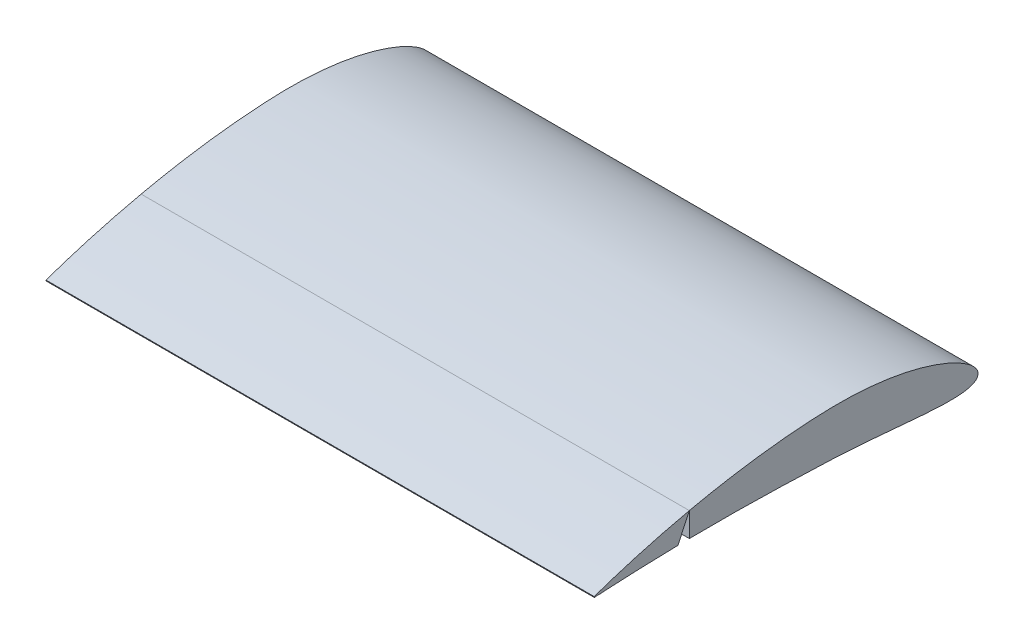
ISO-10303-21;
HEADER;
FILE_DESCRIPTION(('STEP AP214'),'2;1');
FILE_NAME('part.step','',(''),(''),'','','');
FILE_SCHEMA(('AUTOMOTIVE_DESIGN { 1 0 10303 214 1 1 1 1 }'));
ENDSEC;
DATA;
#1=APPLICATION_CONTEXT('core data for automotive mechanical design processes');
#2=APPLICATION_PROTOCOL_DEFINITION('international standard','automotive_design',2000,#1);
#3=PRODUCT_CONTEXT('',#1,'mechanical');
#4=PRODUCT('Part','Part','',(#3));
#5=PRODUCT_RELATED_PRODUCT_CATEGORY('part','',(#4));
#6=PRODUCT_DEFINITION_FORMATION('','',#4);
#7=PRODUCT_DEFINITION_CONTEXT('part definition',#1,'design');
#8=PRODUCT_DEFINITION('design','',#6,#7);
#9=PRODUCT_DEFINITION_SHAPE('','',#8);
#10=(LENGTH_UNIT() NAMED_UNIT(*) SI_UNIT(.MILLI.,.METRE.));
#11=(NAMED_UNIT(*) PLANE_ANGLE_UNIT() SI_UNIT($,.RADIAN.));
#12=(NAMED_UNIT(*) SI_UNIT($,.STERADIAN.) SOLID_ANGLE_UNIT());
#13=UNCERTAINTY_MEASURE_WITH_UNIT(LENGTH_MEASURE(1.E-05),#10,'distance_accuracy_value','');
#14=(GEOMETRIC_REPRESENTATION_CONTEXT(3) GLOBAL_UNCERTAINTY_ASSIGNED_CONTEXT((#13)) GLOBAL_UNIT_ASSIGNED_CONTEXT((#10,
#11,#12)) REPRESENTATION_CONTEXT('',''));
#15=CARTESIAN_POINT('',(0.,0.,0.));
#16=DIRECTION('',(0.,0.,1.));
#17=DIRECTION('',(1.,0.,0.));
#18=AXIS2_PLACEMENT_3D('',#15,#16,#17);
#19=CARTESIAN_POINT('',(-254.,-0.0302571964763549,354.787327227915));
#20=CARTESIAN_POINT('',(-254.,-0.202511549774369,354.777220058735));
#21=CARTESIAN_POINT('',(-254.,-0.758116619532224,354.744619463571));
#22=CARTESIAN_POINT('',(-254.,-0.0353878265544988,352.780150329408));
#23=CARTESIAN_POINT('',(-254.,-0.406394891328532,350.227621537646));
#24=CARTESIAN_POINT('',(-254.,0.191518705423128,345.076973542852));
#25=CARTESIAN_POINT('',(-254.,0.426846954997304,338.388880463138));
#26=CARTESIAN_POINT('',(-254.,0.912902226587254,329.767358245601));
#27=CARTESIAN_POINT('',(-254.,1.37107480853054,319.513378005819));
#28=CARTESIAN_POINT('',(-254.,1.85212662662604,307.681856469284));
#29=CARTESIAN_POINT('',(-254.,2.2828903737653,294.437996631764));
#30=CARTESIAN_POINT('',(-254.,2.65636592644588,279.933149694368));
#31=CARTESIAN_POINT('',(-254.,2.90744759821903,264.337268620967));
#32=CARTESIAN_POINT('',(-254.,3.02848065946825,247.830237404837));
#33=CARTESIAN_POINT('',(-254.,2.97910623211237,224.541124113717));
#34=CARTESIAN_POINT('',(-254.,2.58624656268472,200.671973719441));
#35=CARTESIAN_POINT('',(-254.,1.91789319340299,176.483884619505));
#36=CARTESIAN_POINT('',(-254.,1.28674404323604,158.296467958687));
#37=CARTESIAN_POINT('',(-254.,0.674535202653767,140.48477689744));
#38=CARTESIAN_POINT('',(-254.,-0.458414507964394,117.937239158073));
#39=CARTESIAN_POINT('',(-254.,-2.15355585803942,96.4067365521407));
#40=CARTESIAN_POINT('',(-254.,-3.98391169785236,75.9298626432168));
#41=CARTESIAN_POINT('',(-254.,-5.23803481691952,61.9523939500743));
#42=CARTESIAN_POINT('',(-254.,-6.3018667845873,49.0830780174977));
#43=CARTESIAN_POINT('',(-254.,-7.05379709208437,37.4470572233417));
#44=CARTESIAN_POINT('',(-254.,-7.40487495085787,27.1638266260831));
#45=CARTESIAN_POINT('',(-254.,-7.26852765592077,18.3491197902741));
#46=CARTESIAN_POINT('',(-254.,-6.58746462442697,11.0873159681167));
#47=CARTESIAN_POINT('',(-254.,-5.28808573883758,5.4507808849597));
#48=CARTESIAN_POINT('',(-254.,-3.30894318563573,1.35108725963543));
#49=CARTESIAN_POINT('',(-254.,-0.148325215865237,-0.987487677240321));
#50=CARTESIAN_POINT('',(-254.,3.7967578133831,-0.765838064798878));
#51=CARTESIAN_POINT('',(-254.,7.71649979382027,1.67922407257184));
#52=CARTESIAN_POINT('',(-254.,11.8553419578337,5.92689766090299));
#53=CARTESIAN_POINT('',(-254.,16.2262899348965,12.1072031542234));
#54=CARTESIAN_POINT('',(-254.,20.7343193498453,20.187014187513));
#55=CARTESIAN_POINT('',(-254.,25.2201252971746,30.130463623116));
#56=CARTESIAN_POINT('',(-254.,29.5108543834638,41.8433907768923));
#57=CARTESIAN_POINT('',(-254.,33.4329059974258,55.1997604360673));
#58=CARTESIAN_POINT('',(-254.,36.8104805743368,70.0434509571498));
#59=CARTESIAN_POINT('',(-254.,39.4786761807971,86.1884085277303));
#60=CARTESIAN_POINT('',(-254.,41.32105063238,103.42216726238));
#61=CARTESIAN_POINT('',(-254.,42.2288581946823,121.516747473044));
#62=CARTESIAN_POINT('',(-254.,42.1113766684293,140.09669102153));
#63=CARTESIAN_POINT('',(-254.,41.1132128906756,158.902335219002));
#64=CARTESIAN_POINT('',(-254.,39.0904540579609,183.961657870227));
#65=CARTESIAN_POINT('',(-254.,36.0047557168601,208.774809212926));
#66=CARTESIAN_POINT('',(-254.,31.1455287976255,238.622276389231));
#67=CARTESIAN_POINT('',(-254.,26.6515697314507,261.175777938493));
#68=CARTESIAN_POINT('',(-254.,21.7242725259394,282.422876263721));
#69=CARTESIAN_POINT('',(-254.,17.1306006385399,300.598349456261));
#70=CARTESIAN_POINT('',(-254.,11.7988919274353,319.654473711953));
#71=CARTESIAN_POINT('',(-254.,6.72155114802005,336.024074691811));
#72=CARTESIAN_POINT('',(-254.,3.49779827393597,345.800950265157));
#73=CARTESIAN_POINT('',(-254.,1.92709586834348,350.478726649503));
#74=CARTESIAN_POINT('',(-254.,0.953557869568799,353.29965963041));
#75=CARTESIAN_POINT('',(-254.,0.519388000117919,354.559877308969));
#76=CARTESIAN_POINT('',(-254.,0.410417886541196,354.876173010782));
#77=B_SPLINE_CURVE_WITH_KNOTS('',3,(#19,#20,#21,#22,#23,#24,#25,#26,#27,#28,#29,#30,#31,#32,#33,
#34,#35,#36,#37,#38,#39,#40,#41,#42,#43,#44,#45,#46,#47,#48,#49,#50,#51,#52,#53,#54,#55,#56,#57,
#58,#59,#60,#61,#62,#63,#64,#65,#66,#67,#68,#69,#70,#71,#72,#73,#74,#75,#76),.UNSPECIFIED.,.F.,
.F.,(4,1,1,1,1,1,1,1,1,1,1,1,1,1,1,1,1,1,1,1,1,1,1,1,1,1,1,1,1,1,1,1,1,1,1,1,1,1,1,1,1,1,1,1,1,
1,1,1,1,1,1,1,1,1,1,4),(0.,0.00061435602735338,0.00198160056276364,0.00606849911990259,
0.0128259983002053,0.0221600600259541,0.0339528411484215,0.0480573219049674,0.0643016527838605,
0.0824806064748046,0.102390013464696,0.123786894847983,0.146429707819126,0.170067604158041,
0.219268231220122,0.244299756437978,0.269272617042279,0.293879334559277,0.317367886846568,
0.361825599196296,0.382415541627446,0.401655123624231,0.419361860817184,0.435356743556399,
0.44945739068769,0.461534248286615,0.471483960270294,0.479298491667603,0.485175806315722,
0.489815015537041,0.49445371882196,0.500384211459872,0.508369297965653,0.518670584727767,
0.531320006060474,0.54625561026072,0.563345994084458,0.58242326585592,0.60328874622392,
0.625720296766354,0.649474912467889,0.674310012117921,0.699958821683972,0.725614899189679,
0.751503233324799,0.803021620411888,0.828087427427487,0.875472920842336,0.897280851310736,
0.917503738861992,0.952328750245583,0.978398030734231,0.987765198149775,0.994535224157492,
0.998628423374974,1.),.UNSPECIFIED.);
#78=DIRECTION('',(1.,0.,0.));
#79=VECTOR('',#78,1.);
#80=SURFACE_OF_LINEAR_EXTRUSION('',#77,#79);
#81=DIRECTION('',(1.,0.,0.));
#82=VECTOR('',#81,1.);
#83=CARTESIAN_POINT('',(-254.,2.68576626150921,277.250314183645));
#84=LINE('',#83,#82);
#85=CARTESIAN_POINT('',(-254.,2.6857662610756,277.250314183847));
#86=VERTEX_POINT('',#85);
#87=CARTESIAN_POINT('',(254.,2.68576626107558,277.250314183847));
#88=VERTEX_POINT('',#87);
#89=EDGE_CURVE('E68',#86,#88,#84,.T.);
#90=ORIENTED_EDGE('',*,*,#89,.T.);
#91=CARTESIAN_POINT('',(254.,-0.0302571964763549,354.787327227915));
#92=CARTESIAN_POINT('',(254.,-0.202511549774369,354.777220058735));
#93=CARTESIAN_POINT('',(254.,-0.758116619532224,354.744619463571));
#94=CARTESIAN_POINT('',(254.,-0.0353878265544988,352.780150329408));
#95=CARTESIAN_POINT('',(254.,-0.406394891328532,350.227621537646));
#96=CARTESIAN_POINT('',(254.,0.191518705423128,345.076973542852));
#97=CARTESIAN_POINT('',(254.,0.426846954997304,338.388880463138));
#98=CARTESIAN_POINT('',(254.,0.912902226587254,329.767358245601));
#99=CARTESIAN_POINT('',(254.,1.37107480853054,319.513378005819));
#100=CARTESIAN_POINT('',(254.,1.85212662662604,307.681856469284));
#101=CARTESIAN_POINT('',(254.,2.2828903737653,294.437996631764));
#102=CARTESIAN_POINT('',(254.,2.65636592644588,279.933149694368));
#103=CARTESIAN_POINT('',(254.,2.90744759821903,264.337268620967));
#104=CARTESIAN_POINT('',(254.,3.02848065946825,247.830237404837));
#105=CARTESIAN_POINT('',(254.,2.97910623211237,224.541124113717));
#106=CARTESIAN_POINT('',(254.,2.58624656268472,200.671973719441));
#107=CARTESIAN_POINT('',(254.,1.91789319340299,176.483884619505));
#108=CARTESIAN_POINT('',(254.,1.28674404323604,158.296467958687));
#109=CARTESIAN_POINT('',(254.,0.674535202653767,140.48477689744));
#110=CARTESIAN_POINT('',(254.,-0.458414507964394,117.937239158073));
#111=CARTESIAN_POINT('',(254.,-2.15355585803942,96.4067365521407));
#112=CARTESIAN_POINT('',(254.,-3.98391169785236,75.9298626432168));
#113=CARTESIAN_POINT('',(254.,-5.23803481691952,61.9523939500743));
#114=CARTESIAN_POINT('',(254.,-6.3018667845873,49.0830780174977));
#115=CARTESIAN_POINT('',(254.,-7.05379709208437,37.4470572233417));
#116=CARTESIAN_POINT('',(254.,-7.40487495085787,27.1638266260831));
#117=CARTESIAN_POINT('',(254.,-7.26852765592077,18.3491197902741));
#118=CARTESIAN_POINT('',(254.,-6.58746462442697,11.0873159681167));
#119=CARTESIAN_POINT('',(254.,-5.28808573883758,5.4507808849597));
#120=CARTESIAN_POINT('',(254.,-3.30894318563573,1.35108725963543));
#121=CARTESIAN_POINT('',(254.,-0.148325215865237,-0.987487677240321));
#122=CARTESIAN_POINT('',(254.,3.7967578133831,-0.765838064798878));
#123=CARTESIAN_POINT('',(254.,7.71649979382027,1.67922407257184));
#124=CARTESIAN_POINT('',(254.,11.8553419578337,5.92689766090299));
#125=CARTESIAN_POINT('',(254.,16.2262899348965,12.1072031542234));
#126=CARTESIAN_POINT('',(254.,20.7343193498453,20.187014187513));
#127=CARTESIAN_POINT('',(254.,25.2201252971746,30.130463623116));
#128=CARTESIAN_POINT('',(254.,29.5108543834638,41.8433907768923));
#129=CARTESIAN_POINT('',(254.,33.4329059974258,55.1997604360673));
#130=CARTESIAN_POINT('',(254.,36.8104805743368,70.0434509571498));
#131=CARTESIAN_POINT('',(254.,39.4786761807971,86.1884085277303));
#132=CARTESIAN_POINT('',(254.,41.32105063238,103.42216726238));
#133=CARTESIAN_POINT('',(254.,42.2288581946823,121.516747473044));
#134=CARTESIAN_POINT('',(254.,42.1113766684293,140.09669102153));
#135=CARTESIAN_POINT('',(254.,41.1132128906756,158.902335219002));
#136=CARTESIAN_POINT('',(254.,39.0904540579609,183.961657870227));
#137=CARTESIAN_POINT('',(254.,36.0047557168601,208.774809212926));
#138=CARTESIAN_POINT('',(254.,31.1455287976255,238.622276389231));
#139=CARTESIAN_POINT('',(254.,26.6515697314507,261.175777938493));
#140=CARTESIAN_POINT('',(254.,21.7242725259394,282.422876263721));
#141=CARTESIAN_POINT('',(254.,17.1306006385399,300.598349456261));
#142=CARTESIAN_POINT('',(254.,11.7988919274353,319.654473711953));
#143=CARTESIAN_POINT('',(254.,6.72155114802005,336.024074691811));
#144=CARTESIAN_POINT('',(254.,3.49779827393597,345.800950265157));
#145=CARTESIAN_POINT('',(254.,1.92709586834348,350.478726649503));
#146=CARTESIAN_POINT('',(254.,0.953557869568799,353.29965963041));
#147=CARTESIAN_POINT('',(254.,0.519388000117919,354.559877308969));
#148=CARTESIAN_POINT('',(254.,0.410417886541196,354.876173010782));
#149=B_SPLINE_CURVE_WITH_KNOTS('',3,(#91,#92,#93,#94,#95,#96,#97,#98,#99,#100,#101,#102,#103,
#104,#105,#106,#107,#108,#109,#110,#111,#112,#113,#114,#115,#116,#117,#118,#119,#120,#121,#122,
#123,#124,#125,#126,#127,#128,#129,#130,#131,#132,#133,#134,#135,#136,#137,#138,#139,#140,#141,
#142,#143,#144,#145,#146,#147,#148),.UNSPECIFIED.,.F.,.F.,(4,1,1,1,1,1,1,1,1,1,1,1,1,1,1,1,1,1,
1,1,1,1,1,1,1,1,1,1,1,1,1,1,1,1,1,1,1,1,1,1,1,1,1,1,1,1,1,1,1,1,1,1,1,1,1,4),(0.,
0.00061435602735338,0.00198160056276364,0.00606849911990259,0.0128259983002053,
0.0221600600259541,0.0339528411484215,0.0480573219049674,0.0643016527838605,0.0824806064748046,
0.102390013464696,0.123786894847983,0.146429707819126,0.170067604158041,0.219268231220122,
0.244299756437978,0.269272617042279,0.293879334559277,0.317367886846568,0.361825599196296,
0.382415541627446,0.401655123624231,0.419361860817184,0.435356743556399,0.44945739068769,
0.461534248286615,0.471483960270294,0.479298491667603,0.485175806315722,0.489815015537041,
0.49445371882196,0.500384211459872,0.508369297965653,0.518670584727767,0.531320006060474,
0.54625561026072,0.563345994084458,0.58242326585592,0.60328874622392,0.625720296766354,
0.649474912467889,0.674310012117921,0.699958821683972,0.725614899189679,0.751503233324799,
0.803021620411888,0.828087427427487,0.875472920842336,0.897280851310736,0.917503738861992,
0.952328750245583,0.978398030734231,0.987765198149775,0.994535224157492,0.998628423374974,1.),.UNSPECIFIED.);
#150=CARTESIAN_POINT('',(254.,-0.030257196476355,354.787327227915));
#151=VERTEX_POINT('',#150);
#152=EDGE_CURVE('E54',#151,#88,#149,.T.);
#153=ORIENTED_EDGE('',*,*,#152,.F.);
#154=DIRECTION('',(1.,0.,0.));
#155=VECTOR('',#154,1.);
#156=CARTESIAN_POINT('',(-254.,-0.030257196476355,354.787327227915));
#157=LINE('',#156,#155);
#158=CARTESIAN_POINT('',(-254.,-0.030257196476355,354.787327227915));
#159=VERTEX_POINT('',#158);
#160=EDGE_CURVE('E121',#159,#151,#157,.T.);
#161=ORIENTED_EDGE('',*,*,#160,.F.);
#162=EDGE_CURVE('E103',#159,#86,#77,.T.);
#163=ORIENTED_EDGE('',*,*,#162,.T.);
#164=EDGE_LOOP('',(#90,#153,#161,#163));
#165=FACE_BOUND('',#164,.T.);
#166=ADVANCED_FACE('F50',(#165),#80,.T.);
#167=CARTESIAN_POINT('',(254.,25.3109880456868,266.699999982787));
#168=VERTEX_POINT('',#167);
#169=CARTESIAN_POINT('',(254.,0.410417886541196,354.876173010782));
#170=VERTEX_POINT('',#169);
#171=EDGE_CURVE('E101',#168,#170,#149,.T.);
#172=ORIENTED_EDGE('',*,*,#171,.F.);
#173=DIRECTION('',(-1.,0.,0.));
#174=VECTOR('',#173,1.);
#175=CARTESIAN_POINT('',(254.001,25.3109880418854,266.7));
#176=LINE('',#175,#174);
#177=CARTESIAN_POINT('',(-254.,25.3109880418854,266.7));
#178=VERTEX_POINT('',#177);
#179=EDGE_CURVE('E87',#168,#178,#176,.T.);
#180=ORIENTED_EDGE('',*,*,#179,.T.);
#181=CARTESIAN_POINT('',(-254.,0.410417886541196,354.876173010782));
#182=VERTEX_POINT('',#181);
#183=EDGE_CURVE('E99',#178,#182,#77,.T.);
#184=ORIENTED_EDGE('',*,*,#183,.T.);
#185=DIRECTION('',(1.,0.,0.));
#186=VECTOR('',#185,1.);
#187=CARTESIAN_POINT('',(-254.,0.410417886541196,354.876173010782));
#188=LINE('',#187,#186);
#189=EDGE_CURVE('E108',#182,#170,#188,.T.);
#190=ORIENTED_EDGE('',*,*,#189,.T.);
#191=EDGE_LOOP('',(#172,#180,#184,#190));
#192=FACE_BOUND('',#191,.T.);
#193=ADVANCED_FACE('F97',(#192),#80,.T.);
#194=CARTESIAN_POINT('',(-254.,6.95548452892668,1.34686834904547));
#195=DIRECTION('',(-1.,0.,0.));
#196=DIRECTION('',(0.,0.,1.));
#197=AXIS2_PLACEMENT_3D('',#194,#195,#196);
#198=PLANE('',#197);
#199=DIRECTION('',(0.,0.906307787036649,-0.422618261740701));
#200=VECTOR('',#199,1.);
#201=CARTESIAN_POINT('',(-254.,25.3109880418854,266.7));
#202=LINE('',#201,#200);
#203=EDGE_CURVE('E61',#86,#178,#202,.T.);
#204=ORIENTED_EDGE('',*,*,#203,.F.);
#205=ORIENTED_EDGE('',*,*,#162,.F.);
#206=DIRECTION('',(0.,-0.980275441523261,-0.197636177726589));
#207=VECTOR('',#206,1.);
#208=CARTESIAN_POINT('',(-254.,-0.030257196476355,354.787327227915));
#209=LINE('',#208,#207);
#210=EDGE_CURVE('E94',#182,#159,#209,.T.);
#211=ORIENTED_EDGE('',*,*,#210,.F.);
#212=ORIENTED_EDGE('',*,*,#183,.F.);
#213=EDGE_LOOP('',(#204,#205,#211,#212));
#214=FACE_BOUND('',#213,.T.);
#215=ADVANCED_FACE('F106',(#214),#198,.T.);
#216=CARTESIAN_POINT('',(254.,6.95548452892668,1.34686834904547));
#217=DIRECTION('',(-1.,0.,0.));
#218=DIRECTION('',(0.,0.,1.));
#219=AXIS2_PLACEMENT_3D('',#216,#217,#218);
#220=PLANE('',#219);
#221=ORIENTED_EDGE('',*,*,#152,.T.);
#222=DIRECTION('',(0.,-0.906307787036649,0.422618261740702));
#223=VECTOR('',#222,1.);
#224=CARTESIAN_POINT('',(254.,25.3109880418854,266.7));
#225=LINE('',#224,#223);
#226=EDGE_CURVE('E12',#168,#88,#225,.T.);
#227=ORIENTED_EDGE('',*,*,#226,.F.);
#228=ORIENTED_EDGE('',*,*,#171,.T.);
#229=DIRECTION('',(0.,-0.980275441523261,-0.197636177726589));
#230=VECTOR('',#229,1.);
#231=CARTESIAN_POINT('',(254.,-0.030257196476355,354.787327227915));
#232=LINE('',#231,#230);
#233=EDGE_CURVE('E118',#170,#151,#232,.T.);
#234=ORIENTED_EDGE('',*,*,#233,.T.);
#235=EDGE_LOOP('',(#221,#227,#228,#234));
#236=FACE_BOUND('',#235,.T.);
#237=ADVANCED_FACE('F127',(#236),#220,.F.);
#238=CARTESIAN_POINT('',(-254.,-0.030257196476355,354.787327227915));
#239=DIRECTION('',(0.,-0.197636177726589,0.980275441523261));
#240=DIRECTION('',(0.,-0.980275441523261,-0.197636177726589));
#241=AXIS2_PLACEMENT_3D('',#238,#239,#240);
#242=PLANE('',#241);
#243=ORIENTED_EDGE('',*,*,#160,.T.);
#244=ORIENTED_EDGE('',*,*,#233,.F.);
#245=ORIENTED_EDGE('',*,*,#189,.F.);
#246=ORIENTED_EDGE('',*,*,#210,.T.);
#247=EDGE_LOOP('',(#243,#244,#245,#246));
#248=FACE_BOUND('',#247,.T.);
#249=ADVANCED_FACE('F125',(#248),#242,.T.);
#250=CARTESIAN_POINT('',(254.001,25.3109880418854,266.7));
#251=DIRECTION('',(0.,0.422618261740701,0.906307787036649));
#252=DIRECTION('',(0.,-0.906307787036649,0.422618261740702));
#253=AXIS2_PLACEMENT_3D('',#250,#251,#252);
#254=PLANE('',#253);
#255=ORIENTED_EDGE('',*,*,#203,.T.);
#256=ORIENTED_EDGE('',*,*,#179,.F.);
#257=ORIENTED_EDGE('',*,*,#226,.T.);
#258=ORIENTED_EDGE('',*,*,#89,.F.);
#259=EDGE_LOOP('',(#255,#256,#257,#258));
#260=FACE_BOUND('',#259,.T.);
#261=ADVANCED_FACE('F89',(#260),#254,.F.);
#262=CLOSED_SHELL('',(#166,#193,#215,#237,#249,#261));
#263=MANIFOLD_SOLID_BREP('B2',#262);
#264=CARTESIAN_POINT('',(254.,6.95548452892668,1.34686834904547));
#265=DIRECTION('',(-1.,0.,0.));
#266=DIRECTION('',(0.,0.,1.));
#267=AXIS2_PLACEMENT_3D('',#264,#265,#266);
#268=PLANE('',#267);
#269=CARTESIAN_POINT('',(254.,-0.0302571964763549,354.787327227915));
#270=CARTESIAN_POINT('',(254.,-0.202511549774369,354.777220058735));
#271=CARTESIAN_POINT('',(254.,-0.758116619532224,354.744619463571));
#272=CARTESIAN_POINT('',(254.,-0.0353878265544988,352.780150329408));
#273=CARTESIAN_POINT('',(254.,-0.406394891328532,350.227621537646));
#274=CARTESIAN_POINT('',(254.,0.191518705423128,345.076973542852));
#275=CARTESIAN_POINT('',(254.,0.426846954997304,338.388880463138));
#276=CARTESIAN_POINT('',(254.,0.912902226587254,329.767358245601));
#277=CARTESIAN_POINT('',(254.,1.37107480853054,319.513378005819));
#278=CARTESIAN_POINT('',(254.,1.85212662662604,307.681856469284));
#279=CARTESIAN_POINT('',(254.,2.2828903737653,294.437996631764));
#280=CARTESIAN_POINT('',(254.,2.65636592644588,279.933149694368));
#281=CARTESIAN_POINT('',(254.,2.90744759821903,264.337268620967));
#282=CARTESIAN_POINT('',(254.,3.02848065946825,247.830237404837));
#283=CARTESIAN_POINT('',(254.,2.97910623211237,224.541124113717));
#284=CARTESIAN_POINT('',(254.,2.58624656268472,200.671973719441));
#285=CARTESIAN_POINT('',(254.,1.91789319340299,176.483884619505));
#286=CARTESIAN_POINT('',(254.,1.28674404323604,158.296467958687));
#287=CARTESIAN_POINT('',(254.,0.674535202653767,140.48477689744));
#288=CARTESIAN_POINT('',(254.,-0.458414507964394,117.937239158073));
#289=CARTESIAN_POINT('',(254.,-2.15355585803942,96.4067365521407));
#290=CARTESIAN_POINT('',(254.,-3.98391169785236,75.9298626432168));
#291=CARTESIAN_POINT('',(254.,-5.23803481691952,61.9523939500743));
#292=CARTESIAN_POINT('',(254.,-6.3018667845873,49.0830780174977));
#293=CARTESIAN_POINT('',(254.,-7.05379709208437,37.4470572233417));
#294=CARTESIAN_POINT('',(254.,-7.40487495085787,27.1638266260831));
#295=CARTESIAN_POINT('',(254.,-7.26852765592077,18.3491197902741));
#296=CARTESIAN_POINT('',(254.,-6.58746462442697,11.0873159681167));
#297=CARTESIAN_POINT('',(254.,-5.28808573883758,5.4507808849597));
#298=CARTESIAN_POINT('',(254.,-3.30894318563573,1.35108725963543));
#299=CARTESIAN_POINT('',(254.,-0.148325215865237,-0.987487677240321));
#300=CARTESIAN_POINT('',(254.,3.7967578133831,-0.765838064798878));
#301=CARTESIAN_POINT('',(254.,7.71649979382027,1.67922407257184));
#302=CARTESIAN_POINT('',(254.,11.8553419578337,5.92689766090299));
#303=CARTESIAN_POINT('',(254.,16.2262899348965,12.1072031542234));
#304=CARTESIAN_POINT('',(254.,20.7343193498453,20.187014187513));
#305=CARTESIAN_POINT('',(254.,25.2201252971746,30.130463623116));
#306=CARTESIAN_POINT('',(254.,29.5108543834638,41.8433907768923));
#307=CARTESIAN_POINT('',(254.,33.4329059974258,55.1997604360673));
#308=CARTESIAN_POINT('',(254.,36.8104805743368,70.0434509571498));
#309=CARTESIAN_POINT('',(254.,39.4786761807971,86.1884085277303));
#310=CARTESIAN_POINT('',(254.,41.32105063238,103.42216726238));
#311=CARTESIAN_POINT('',(254.,42.2288581946823,121.516747473044));
#312=CARTESIAN_POINT('',(254.,42.1113766684293,140.09669102153));
#313=CARTESIAN_POINT('',(254.,41.1132128906756,158.902335219002));
#314=CARTESIAN_POINT('',(254.,39.0904540579609,183.961657870227));
#315=CARTESIAN_POINT('',(254.,36.0047557168601,208.774809212926));
#316=CARTESIAN_POINT('',(254.,31.1455287976255,238.622276389231));
#317=CARTESIAN_POINT('',(254.,26.6515697314507,261.175777938493));
#318=CARTESIAN_POINT('',(254.,21.7242725259394,282.422876263721));
#319=CARTESIAN_POINT('',(254.,17.1306006385399,300.598349456261));
#320=CARTESIAN_POINT('',(254.,11.7988919274353,319.654473711953));
#321=CARTESIAN_POINT('',(254.,6.72155114802005,336.024074691811));
#322=CARTESIAN_POINT('',(254.,3.49779827393597,345.800950265157));
#323=CARTESIAN_POINT('',(254.,1.92709586834348,350.478726649503));
#324=CARTESIAN_POINT('',(254.,0.953557869568799,353.29965963041));
#325=CARTESIAN_POINT('',(254.,0.519388000117919,354.559877308969));
#326=CARTESIAN_POINT('',(254.,0.410417886541196,354.876173010782));
#327=B_SPLINE_CURVE_WITH_KNOTS('',3,(#269,#270,#271,#272,#273,#274,#275,#276,#277,#278,#279,
#280,#281,#282,#283,#284,#285,#286,#287,#288,#289,#290,#291,#292,#293,#294,#295,#296,#297,#298,
#299,#300,#301,#302,#303,#304,#305,#306,#307,#308,#309,#310,#311,#312,#313,#314,#315,#316,#317,
#318,#319,#320,#321,#322,#323,#324,#325,#326),.UNSPECIFIED.,.F.,.F.,(4,1,1,1,1,1,1,1,1,1,1,1,1,
1,1,1,1,1,1,1,1,1,1,1,1,1,1,1,1,1,1,1,1,1,1,1,1,1,1,1,1,1,1,1,1,1,1,1,1,1,1,1,1,1,1,4),(0.,
0.00061435602735338,0.00198160056276364,0.00606849911990259,0.0128259983002053,
0.0221600600259541,0.0339528411484215,0.0480573219049674,0.0643016527838605,0.0824806064748046,
0.102390013464696,0.123786894847983,0.146429707819126,0.170067604158041,0.219268231220122,
0.244299756437978,0.269272617042279,0.293879334559277,0.317367886846568,0.361825599196296,
0.382415541627446,0.401655123624231,0.419361860817184,0.435356743556399,0.44945739068769,
0.461534248286615,0.471483960270294,0.479298491667603,0.485175806315722,0.489815015537041,
0.49445371882196,0.500384211459872,0.508369297965653,0.518670584727767,0.531320006060474,
0.54625561026072,0.563345994084458,0.58242326585592,0.60328874622392,0.625720296766354,
0.649474912467889,0.674310012117921,0.699958821683972,0.725614899189679,0.751503233324799,
0.803021620411888,0.828087427427487,0.875472920842336,0.897280851310736,0.917503738861992,
0.952328750245583,0.978398030734231,0.987765198149775,0.994535224157492,0.998628423374974,1.),.UNSPECIFIED.);
#328=CARTESIAN_POINT('',(254.,2.85478886450617,266.699999999999));
#329=VERTEX_POINT('',#328);
#330=CARTESIAN_POINT('',(254.,25.3109880418854,266.7));
#331=VERTEX_POINT('',#330);
#332=EDGE_CURVE('E220',#329,#331,#327,.T.);
#333=ORIENTED_EDGE('',*,*,#332,.T.);
#334=DIRECTION('',(0.,1.,0.));
#335=VECTOR('',#334,1.);
#336=CARTESIAN_POINT('',(254.,25.3109880418854,266.7));
#337=LINE('',#336,#335);
#338=EDGE_CURVE('E215',#329,#331,#337,.T.);
#339=ORIENTED_EDGE('',*,*,#338,.F.);
#340=EDGE_LOOP('',(#333,#339));
#341=FACE_BOUND('',#340,.T.);
#342=ADVANCED_FACE('F185',(#341),#268,.F.);
#343=CARTESIAN_POINT('',(-254.,6.95548452892668,1.34686834904547));
#344=DIRECTION('',(-1.,0.,0.));
#345=DIRECTION('',(0.,0.,1.));
#346=AXIS2_PLACEMENT_3D('',#343,#344,#345);
#347=PLANE('',#346);
#348=CARTESIAN_POINT('',(-254.,12.7,241.3));
#349=DIRECTION('',(-1.,0.,0.));
#350=DIRECTION('',(0.,0.,1.));
#351=AXIS2_PLACEMENT_3D('',#348,#349,#350);
#352=CIRCLE('',#351,3.175);
#353=CARTESIAN_POINT('',(-254.,12.7,244.475));
#354=VERTEX_POINT('',#353);
#355=EDGE_CURVE('E250',#354,#354,#352,.T.);
#356=ORIENTED_EDGE('',*,*,#355,.F.);
#357=EDGE_LOOP('',(#356));
#358=FACE_BOUND('',#357,.T.);
#359=CARTESIAN_POINT('',(-254.,12.7,63.5));
#360=DIRECTION('',(-1.,0.,0.));
#361=DIRECTION('',(0.,0.,1.));
#362=AXIS2_PLACEMENT_3D('',#359,#360,#361);
#363=CIRCLE('',#362,6.35);
#364=CARTESIAN_POINT('',(-254.,12.7,69.85));
#365=VERTEX_POINT('',#364);
#366=EDGE_CURVE('E242',#365,#365,#363,.T.);
#367=ORIENTED_EDGE('',*,*,#366,.F.);
#368=EDGE_LOOP('',(#367));
#369=FACE_BOUND('',#368,.T.);
#370=DIRECTION('',(0.,-1.,0.));
#371=VECTOR('',#370,1.);
#372=CARTESIAN_POINT('',(-254.,25.3109880418854,266.7));
#373=LINE('',#372,#371);
#374=CARTESIAN_POINT('',(-254.,25.3109880418854,266.7));
#375=VERTEX_POINT('',#374);
#376=CARTESIAN_POINT('',(-254.,2.85478886450617,266.699999999999));
#377=VERTEX_POINT('',#376);
#378=EDGE_CURVE('E210',#375,#377,#373,.T.);
#379=ORIENTED_EDGE('',*,*,#378,.F.);
#380=CARTESIAN_POINT('',(-254.,-0.0302571964763549,354.787327227915));
#381=CARTESIAN_POINT('',(-254.,-0.202511549774369,354.777220058735));
#382=CARTESIAN_POINT('',(-254.,-0.758116619532224,354.744619463571));
#383=CARTESIAN_POINT('',(-254.,-0.0353878265544988,352.780150329408));
#384=CARTESIAN_POINT('',(-254.,-0.406394891328532,350.227621537646));
#385=CARTESIAN_POINT('',(-254.,0.191518705423128,345.076973542852));
#386=CARTESIAN_POINT('',(-254.,0.426846954997304,338.388880463138));
#387=CARTESIAN_POINT('',(-254.,0.912902226587254,329.767358245601));
#388=CARTESIAN_POINT('',(-254.,1.37107480853054,319.513378005819));
#389=CARTESIAN_POINT('',(-254.,1.85212662662604,307.681856469284));
#390=CARTESIAN_POINT('',(-254.,2.2828903737653,294.437996631764));
#391=CARTESIAN_POINT('',(-254.,2.65636592644588,279.933149694368));
#392=CARTESIAN_POINT('',(-254.,2.90744759821903,264.337268620967));
#393=CARTESIAN_POINT('',(-254.,3.02848065946825,247.830237404837));
#394=CARTESIAN_POINT('',(-254.,2.97910623211237,224.541124113717));
#395=CARTESIAN_POINT('',(-254.,2.58624656268472,200.671973719441));
#396=CARTESIAN_POINT('',(-254.,1.91789319340299,176.483884619505));
#397=CARTESIAN_POINT('',(-254.,1.28674404323604,158.296467958687));
#398=CARTESIAN_POINT('',(-254.,0.674535202653767,140.48477689744));
#399=CARTESIAN_POINT('',(-254.,-0.458414507964394,117.937239158073));
#400=CARTESIAN_POINT('',(-254.,-2.15355585803942,96.4067365521407));
#401=CARTESIAN_POINT('',(-254.,-3.98391169785236,75.9298626432168));
#402=CARTESIAN_POINT('',(-254.,-5.23803481691952,61.9523939500743));
#403=CARTESIAN_POINT('',(-254.,-6.3018667845873,49.0830780174977));
#404=CARTESIAN_POINT('',(-254.,-7.05379709208437,37.4470572233417));
#405=CARTESIAN_POINT('',(-254.,-7.40487495085787,27.1638266260831));
#406=CARTESIAN_POINT('',(-254.,-7.26852765592077,18.3491197902741));
#407=CARTESIAN_POINT('',(-254.,-6.58746462442697,11.0873159681167));
#408=CARTESIAN_POINT('',(-254.,-5.28808573883758,5.4507808849597));
#409=CARTESIAN_POINT('',(-254.,-3.30894318563573,1.35108725963543));
#410=CARTESIAN_POINT('',(-254.,-0.148325215865237,-0.987487677240321));
#411=CARTESIAN_POINT('',(-254.,3.7967578133831,-0.765838064798878));
#412=CARTESIAN_POINT('',(-254.,7.71649979382027,1.67922407257184));
#413=CARTESIAN_POINT('',(-254.,11.8553419578337,5.92689766090299));
#414=CARTESIAN_POINT('',(-254.,16.2262899348965,12.1072031542234));
#415=CARTESIAN_POINT('',(-254.,20.7343193498453,20.187014187513));
#416=CARTESIAN_POINT('',(-254.,25.2201252971746,30.130463623116));
#417=CARTESIAN_POINT('',(-254.,29.5108543834638,41.8433907768923));
#418=CARTESIAN_POINT('',(-254.,33.4329059974258,55.1997604360673));
#419=CARTESIAN_POINT('',(-254.,36.8104805743368,70.0434509571498));
#420=CARTESIAN_POINT('',(-254.,39.4786761807971,86.1884085277303));
#421=CARTESIAN_POINT('',(-254.,41.32105063238,103.42216726238));
#422=CARTESIAN_POINT('',(-254.,42.2288581946823,121.516747473044));
#423=CARTESIAN_POINT('',(-254.,42.1113766684293,140.09669102153));
#424=CARTESIAN_POINT('',(-254.,41.1132128906756,158.902335219002));
#425=CARTESIAN_POINT('',(-254.,39.0904540579609,183.961657870227));
#426=CARTESIAN_POINT('',(-254.,36.0047557168601,208.774809212926));
#427=CARTESIAN_POINT('',(-254.,31.1455287976255,238.622276389231));
#428=CARTESIAN_POINT('',(-254.,26.6515697314507,261.175777938493));
#429=CARTESIAN_POINT('',(-254.,21.7242725259394,282.422876263721));
#430=CARTESIAN_POINT('',(-254.,17.1306006385399,300.598349456261));
#431=CARTESIAN_POINT('',(-254.,11.7988919274353,319.654473711953));
#432=CARTESIAN_POINT('',(-254.,6.72155114802005,336.024074691811));
#433=CARTESIAN_POINT('',(-254.,3.49779827393597,345.800950265157));
#434=CARTESIAN_POINT('',(-254.,1.92709586834348,350.478726649503));
#435=CARTESIAN_POINT('',(-254.,0.953557869568799,353.29965963041));
#436=CARTESIAN_POINT('',(-254.,0.519388000117919,354.559877308969));
#437=CARTESIAN_POINT('',(-254.,0.410417886541196,354.876173010782));
#438=B_SPLINE_CURVE_WITH_KNOTS('',3,(#380,#381,#382,#383,#384,#385,#386,#387,#388,#389,#390,
#391,#392,#393,#394,#395,#396,#397,#398,#399,#400,#401,#402,#403,#404,#405,#406,#407,#408,#409,
#410,#411,#412,#413,#414,#415,#416,#417,#418,#419,#420,#421,#422,#423,#424,#425,#426,#427,#428,
#429,#430,#431,#432,#433,#434,#435,#436,#437),.UNSPECIFIED.,.F.,.F.,(4,1,1,1,1,1,1,1,1,1,1,1,1,
1,1,1,1,1,1,1,1,1,1,1,1,1,1,1,1,1,1,1,1,1,1,1,1,1,1,1,1,1,1,1,1,1,1,1,1,1,1,1,1,1,1,4),(0.,
0.00061435602735338,0.00198160056276364,0.00606849911990259,0.0128259983002053,
0.0221600600259541,0.0339528411484215,0.0480573219049674,0.0643016527838605,0.0824806064748046,
0.102390013464696,0.123786894847983,0.146429707819126,0.170067604158041,0.219268231220122,
0.244299756437978,0.269272617042279,0.293879334559277,0.317367886846568,0.361825599196296,
0.382415541627446,0.401655123624231,0.419361860817184,0.435356743556399,0.44945739068769,
0.461534248286615,0.471483960270294,0.479298491667603,0.485175806315722,0.489815015537041,
0.49445371882196,0.500384211459872,0.508369297965653,0.518670584727767,0.531320006060474,
0.54625561026072,0.563345994084458,0.58242326585592,0.60328874622392,0.625720296766354,
0.649474912467889,0.674310012117921,0.699958821683972,0.725614899189679,0.751503233324799,
0.803021620411888,0.828087427427487,0.875472920842336,0.897280851310736,0.917503738861992,
0.952328750245583,0.978398030734231,0.987765198149775,0.994535224157492,0.998628423374974,1.),.UNSPECIFIED.);
#439=EDGE_CURVE('E194',#377,#375,#438,.T.);
#440=ORIENTED_EDGE('',*,*,#439,.F.);
#441=EDGE_LOOP('',(#379,#440));
#442=FACE_BOUND('',#441,.T.);
#443=ADVANCED_FACE('F224',(#358,#369,#442),#347,.T.);
#444=DIRECTION('',(1.,0.,0.));
#445=VECTOR('',#444,1.);
#446=SURFACE_OF_LINEAR_EXTRUSION('',#438,#445);
#447=DIRECTION('',(1.,0.,0.));
#448=VECTOR('',#447,1.);
#449=CARTESIAN_POINT('',(-254.,2.85478886450615,266.7));
#450=LINE('',#449,#448);
#451=EDGE_CURVE('E204',#329,#377,#450,.F.);
#452=ORIENTED_EDGE('',*,*,#451,.T.);
#453=ORIENTED_EDGE('',*,*,#439,.T.);
#454=DIRECTION('',(1.,0.,0.));
#455=VECTOR('',#454,1.);
#456=CARTESIAN_POINT('',(-254.,25.3109880418854,266.7));
#457=LINE('',#456,#455);
#458=EDGE_CURVE('E48',#331,#375,#457,.F.);
#459=ORIENTED_EDGE('',*,*,#458,.F.);
#460=ORIENTED_EDGE('',*,*,#332,.F.);
#461=EDGE_LOOP('',(#452,#453,#459,#460));
#462=FACE_BOUND('',#461,.T.);
#463=ADVANCED_FACE('F187',(#462),#446,.T.);
#464=CARTESIAN_POINT('',(254.001,25.3109880418854,266.7));
#465=DIRECTION('',(0.,0.,-1.));
#466=DIRECTION('',(0.,1.,0.));
#467=AXIS2_PLACEMENT_3D('',#464,#465,#466);
#468=PLANE('',#467);
#469=ORIENTED_EDGE('',*,*,#338,.T.);
#470=ORIENTED_EDGE('',*,*,#458,.T.);
#471=ORIENTED_EDGE('',*,*,#378,.T.);
#472=ORIENTED_EDGE('',*,*,#451,.F.);
#473=EDGE_LOOP('',(#469,#470,#471,#472));
#474=FACE_BOUND('',#473,.T.);
#475=ADVANCED_FACE('F211',(#474),#468,.F.);
#476=CARTESIAN_POINT('',(-152.4,12.7,63.5));
#477=DIRECTION('',(-1.,0.,0.));
#478=DIRECTION('',(0.,0.,1.));
#479=AXIS2_PLACEMENT_3D('',#476,#477,#478);
#480=CYLINDRICAL_SURFACE('',#479,6.35);
#481=CARTESIAN_POINT('',(-152.4,12.7,63.5));
#482=DIRECTION('',(-1.,0.,0.));
#483=DIRECTION('',(0.,0.,1.));
#484=AXIS2_PLACEMENT_3D('',#481,#482,#483);
#485=CIRCLE('',#484,6.35);
#486=CARTESIAN_POINT('',(-152.4,12.7,69.85));
#487=VERTEX_POINT('',#486);
#488=EDGE_CURVE('E222',#487,#487,#485,.T.);
#489=ORIENTED_EDGE('',*,*,#488,.F.);
#490=EDGE_LOOP('',(#489));
#491=FACE_BOUND('',#490,.T.);
#492=ORIENTED_EDGE('',*,*,#366,.T.);
#493=EDGE_LOOP('',(#492));
#494=FACE_BOUND('',#493,.T.);
#495=ADVANCED_FACE('F271',(#491,#494),#480,.F.);
#496=CARTESIAN_POINT('',(-152.4,12.7,63.5));
#497=DIRECTION('',(-1.,0.,0.));
#498=DIRECTION('',(0.,0.,1.));
#499=AXIS2_PLACEMENT_3D('',#496,#497,#498);
#500=PLANE('',#499);
#501=ORIENTED_EDGE('',*,*,#488,.T.);
#502=EDGE_LOOP('',(#501));
#503=FACE_BOUND('',#502,.T.);
#504=ADVANCED_FACE('F263',(#503),#500,.T.);
#505=CARTESIAN_POINT('',(-127.,12.7,241.3));
#506=DIRECTION('',(-1.,0.,0.));
#507=DIRECTION('',(0.,0.,1.));
#508=AXIS2_PLACEMENT_3D('',#505,#506,#507);
#509=CYLINDRICAL_SURFACE('',#508,3.175);
#510=CARTESIAN_POINT('',(-127.,12.7,241.3));
#511=DIRECTION('',(-1.,0.,0.));
#512=DIRECTION('',(0.,0.,1.));
#513=AXIS2_PLACEMENT_3D('',#510,#511,#512);
#514=CIRCLE('',#513,3.175);
#515=CARTESIAN_POINT('',(-127.,12.7,244.475));
#516=VERTEX_POINT('',#515);
#517=EDGE_CURVE('E246',#516,#516,#514,.T.);
#518=ORIENTED_EDGE('',*,*,#517,.F.);
#519=EDGE_LOOP('',(#518));
#520=FACE_BOUND('',#519,.T.);
#521=ORIENTED_EDGE('',*,*,#355,.T.);
#522=EDGE_LOOP('',(#521));
#523=FACE_BOUND('',#522,.T.);
#524=ADVANCED_FACE('F260',(#520,#523),#509,.F.);
#525=CARTESIAN_POINT('',(-127.,12.7,241.3));
#526=DIRECTION('',(-1.,0.,0.));
#527=DIRECTION('',(0.,0.,1.));
#528=AXIS2_PLACEMENT_3D('',#525,#526,#527);
#529=PLANE('',#528);
#530=ORIENTED_EDGE('',*,*,#517,.T.);
#531=EDGE_LOOP('',(#530));
#532=FACE_BOUND('',#531,.T.);
#533=ADVANCED_FACE('F258',(#532),#529,.T.);
#534=CLOSED_SHELL('',(#342,#443,#463,#475,#495,#504,#524,#533));
#535=MANIFOLD_SOLID_BREP('B6',#534);
#536=ADVANCED_BREP_SHAPE_REPRESENTATION('',(#18,#263,#535),#14);
#537=SHAPE_DEFINITION_REPRESENTATION(#9,#536);
ENDSEC;
END-ISO-10303-21;
